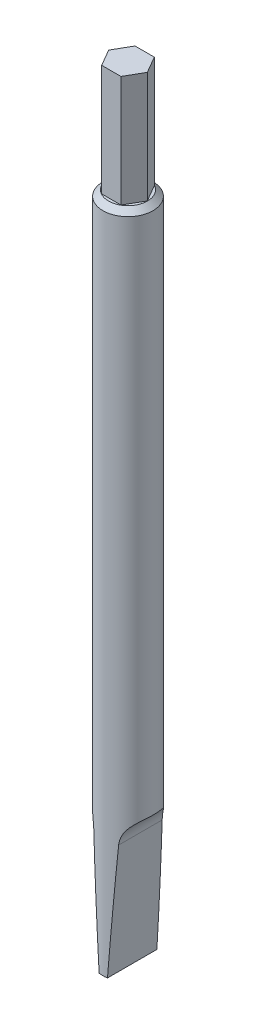
ISO-10303-21;
HEADER;
FILE_DESCRIPTION(('STEP AP214'),'2;1');
FILE_NAME('part.step','',(''),(''),'','','');
FILE_SCHEMA(('AUTOMOTIVE_DESIGN { 1 0 10303 214 1 1 1 1 }'));
ENDSEC;
DATA;
#1=APPLICATION_CONTEXT('core data for automotive mechanical design processes');
#2=APPLICATION_PROTOCOL_DEFINITION('international standard','automotive_design',2000,#1);
#3=PRODUCT_CONTEXT('',#1,'mechanical');
#4=PRODUCT('Part','Part','',(#3));
#5=PRODUCT_RELATED_PRODUCT_CATEGORY('part','',(#4));
#6=PRODUCT_DEFINITION_FORMATION('','',#4);
#7=PRODUCT_DEFINITION_CONTEXT('part definition',#1,'design');
#8=PRODUCT_DEFINITION('design','',#6,#7);
#9=PRODUCT_DEFINITION_SHAPE('','',#8);
#10=(LENGTH_UNIT() NAMED_UNIT(*) SI_UNIT(.MILLI.,.METRE.));
#11=(NAMED_UNIT(*) PLANE_ANGLE_UNIT() SI_UNIT($,.RADIAN.));
#12=(NAMED_UNIT(*) SI_UNIT($,.STERADIAN.) SOLID_ANGLE_UNIT());
#13=UNCERTAINTY_MEASURE_WITH_UNIT(LENGTH_MEASURE(1.E-05),#10,'distance_accuracy_value','');
#14=(GEOMETRIC_REPRESENTATION_CONTEXT(3) GLOBAL_UNCERTAINTY_ASSIGNED_CONTEXT((#13)) GLOBAL_UNIT_ASSIGNED_CONTEXT((#10,
#11,#12)) REPRESENTATION_CONTEXT('',''));
#15=CARTESIAN_POINT('',(0.,0.,0.));
#16=DIRECTION('',(0.,0.,1.));
#17=DIRECTION('',(1.,0.,0.));
#18=AXIS2_PLACEMENT_3D('',#15,#16,#17);
#19=CARTESIAN_POINT('',(0.,-120.,0.));
#20=DIRECTION('',(0.,1.,0.));
#21=DIRECTION('',(0.,0.,1.));
#22=AXIS2_PLACEMENT_3D('',#19,#20,#21);
#23=PLANE('',#22);
#24=DIRECTION('',(0.,0.,1.));
#25=VECTOR('',#24,1.);
#26=CARTESIAN_POINT('',(-0.750000000000048,-120.,-7.));
#27=LINE('',#26,#25);
#28=CARTESIAN_POINT('',(-0.750000000000048,-120.,-4.4370598373247));
#29=VERTEX_POINT('',#28);
#30=CARTESIAN_POINT('',(-0.750000000000046,-120.,4.4370598373247));
#31=VERTEX_POINT('',#30);
#32=EDGE_CURVE('E58',#29,#31,#27,.T.);
#33=ORIENTED_EDGE('',*,*,#32,.F.);
#34=CARTESIAN_POINT('',(0.,-120.,0.));
#35=DIRECTION('',(0.,1.,0.));
#36=DIRECTION('',(0.,0.,1.));
#37=AXIS2_PLACEMENT_3D('',#34,#35,#36);
#38=CIRCLE('',#37,4.5);
#39=CARTESIAN_POINT('',(0.750000000000048,-120.,-4.4370598373247));
#40=VERTEX_POINT('',#39);
#41=EDGE_CURVE('E143',#40,#29,#38,.T.);
#42=ORIENTED_EDGE('',*,*,#41,.F.);
#43=DIRECTION('',(0.,0.,1.));
#44=VECTOR('',#43,1.);
#45=CARTESIAN_POINT('',(0.750000000000048,-120.,-7.));
#46=LINE('',#45,#44);
#47=CARTESIAN_POINT('',(0.750000000000048,-120.,4.4370598373247));
#48=VERTEX_POINT('',#47);
#49=EDGE_CURVE('E164',#40,#48,#46,.T.);
#50=ORIENTED_EDGE('',*,*,#49,.T.);
#51=EDGE_CURVE('E242',#31,#48,#38,.T.);
#52=ORIENTED_EDGE('',*,*,#51,.F.);
#53=EDGE_LOOP('',(#33,#42,#50,#52));
#54=FACE_BOUND('',#53,.T.);
#55=ADVANCED_FACE('F44',(#54),#23,.F.);
#56=CARTESIAN_POINT('',(0.,-120.,0.));
#57=DIRECTION('',(0.,1.,0.));
#58=DIRECTION('',(0.,0.,1.));
#59=AXIS2_PLACEMENT_3D('',#56,#57,#58);
#60=CYLINDRICAL_SURFACE('',#59,4.5);
#61=CARTESIAN_POINT('',(0.,-130.725499692536,0.));
#62=DIRECTION('',(0.997564050259825,0.069756473744118,0.));
#63=DIRECTION('',(-0.0697564737441181,0.997564050259825,0.));
#64=AXIS2_PLACEMENT_3D('',#61,#62,#63);
#65=ELLIPSE('',#64,64.5101416179233,4.5);
#66=CARTESIAN_POINT('',(-2.22904475760726,-98.8486745427176,-3.90913794443015));
#67=VERTEX_POINT('',#66);
#68=EDGE_CURVE('E246',#67,#29,#65,.F.);
#69=ORIENTED_EDGE('',*,*,#68,.F.);
#70=CARTESIAN_POINT('',(-2.22904475760726,-98.8486745427176,-3.90913794443015));
#71=CARTESIAN_POINT('',(-2.23702621646599,-98.7342787867655,-3.90455301412375));
#72=CARTESIAN_POINT('',(-2.24897237830153,-98.6202409171084,-3.8977412424686));
#73=CARTESIAN_POINT('',(-2.28058564520308,-98.3935946749975,-3.87934716952949));
#74=CARTESIAN_POINT('',(-2.30025513874378,-98.2809867558942,-3.8677633924271));
#75=CARTESIAN_POINT('',(-2.34719584400121,-98.0575363098174,-3.83945395370803));
#76=CARTESIAN_POINT('',(-2.37449738593542,-97.9467027315232,-3.82270774842759));
#77=CARTESIAN_POINT('',(-2.43629843668387,-97.7280755292208,-3.78362142886627));
#78=CARTESIAN_POINT('',(-2.47079727307916,-97.6202816222935,-3.76128183711765));
#79=CARTESIAN_POINT('',(-2.54660406210738,-97.408216560908,-3.71037687082045));
#80=CARTESIAN_POINT('',(-2.58793317273797,-97.3039576056025,-3.68179205909023));
#81=CARTESIAN_POINT('',(-2.67661907337453,-97.1001945116028,-3.617830510263));
#82=CARTESIAN_POINT('',(-2.72397536155982,-97.0006899780047,-3.58245433848772));
#83=CARTESIAN_POINT('',(-2.82369022401107,-96.8075192575304,-3.50439309765493));
#84=CARTESIAN_POINT('',(-2.87603716753387,-96.7138402977947,-3.46172484722618));
#85=CARTESIAN_POINT('',(-2.98468304106419,-96.5329182426583,-3.36849906138697));
#86=CARTESIAN_POINT('',(-3.04098155002159,-96.4456744635971,-3.31794236581196));
#87=CARTESIAN_POINT('',(-3.15218326142471,-96.2841591543177,-3.2123516689927));
#88=CARTESIAN_POINT('',(-3.20691354791837,-96.2094077407048,-3.15786937601245));
#89=CARTESIAN_POINT('',(-3.31737747759314,-96.0666193508309,-3.04161662066179));
#90=CARTESIAN_POINT('',(-3.37311101683253,-95.9985816836745,-2.97984690966121));
#91=CARTESIAN_POINT('',(-3.48426592602746,-95.86955084334,-2.84907936053115));
#92=CARTESIAN_POINT('',(-3.53968727940554,-95.8085580409603,-2.78008114230153));
#93=CARTESIAN_POINT('',(-3.64887642748699,-95.6937825954874,-2.63513370421151));
#94=CARTESIAN_POINT('',(-3.70264431849594,-95.6399995318489,-2.55918489021554));
#95=CARTESIAN_POINT('',(-3.80240311983266,-95.5442692448825,-2.40814230508492));
#96=CARTESIAN_POINT('',(-3.84865318926918,-95.5016872490807,-2.33362025159598));
#97=CARTESIAN_POINT('',(-3.9378876480611,-95.4222911569373,-2.1796692127272));
#98=CARTESIAN_POINT('',(-3.98087099331307,-95.3854789007472,-2.10023867309246));
#99=CARTESIAN_POINT('',(-4.06277994182611,-95.3174332764953,-1.93704749879933));
#100=CARTESIAN_POINT('',(-4.10170651974428,-95.2861985671095,-1.85328791148249));
#101=CARTESIAN_POINT('',(-4.17488472425587,-95.2290171572651,-1.68196842738304));
#102=CARTESIAN_POINT('',(-4.20913455413963,-95.2030724872524,-1.59440708697686));
#103=CARTESIAN_POINT('',(-4.27279286567593,-95.1559191061295,-1.41506271783801));
#104=CARTESIAN_POINT('',(-4.30213927068598,-95.1347700620595,-1.32324199674037));
#105=CARTESIAN_POINT('',(-4.35507754079022,-95.0973075393074,-1.13696065361358));
#106=CARTESIAN_POINT('',(-4.37866744162886,-95.0809957107901,-1.04249914270462));
#107=CARTESIAN_POINT('',(-4.4197653908091,-95.0529601985635,-0.851591587608831));
#108=CARTESIAN_POINT('',(-4.43727323385286,-95.0412366697289,-0.755145476548861));
#109=CARTESIAN_POINT('',(-4.4659873816768,-95.0221761964409,-0.560890393805502));
#110=CARTESIAN_POINT('',(-4.47719343889634,-95.014839424317,-0.463081368735776));
#111=CARTESIAN_POINT('',(-4.49360841061999,-95.0041316886795,-0.261310371063201));
#112=CARTESIAN_POINT('',(-4.49845362158802,-95.001001013529,-0.157305834671538));
#113=CARTESIAN_POINT('',(-4.50091605877074,-94.9994070035386,0.0507912499549168));
#114=CARTESIAN_POINT('',(-4.49853547669683,-95.0009422534409,0.154883761930143));
#115=CARTESIAN_POINT('',(-4.48657840402764,-95.0087117525025,0.362541163810425));
#116=CARTESIAN_POINT('',(-4.47699769520909,-95.0149487562099,0.466105708581837));
#117=CARTESIAN_POINT('',(-4.45076624447433,-95.0322505562378,0.671888596740895));
#118=CARTESIAN_POINT('',(-4.43411819762721,-95.0433135122668,0.77410743799697));
#119=CARTESIAN_POINT('',(-4.39361106688486,-95.0707334624376,0.978376392649263));
#120=CARTESIAN_POINT('',(-4.36962505271904,-95.0871840351622,1.08038886357039));
#121=CARTESIAN_POINT('',(-4.31493201627953,-95.1256145106216,1.28148931228222));
#122=CARTESIAN_POINT('',(-4.28422761082079,-95.1475922610158,1.38057841172089));
#123=CARTESIAN_POINT('',(-4.21660333411226,-95.1974328302393,1.57507265805737));
#124=CARTESIAN_POINT('',(-4.17968451408553,-95.2252946539282,1.67047842467343));
#125=CARTESIAN_POINT('',(-4.10029171346883,-95.287277239646,1.85684260853614));
#126=CARTESIAN_POINT('',(-4.05781801371186,-95.3213976852984,1.94780125029288));
#127=CARTESIAN_POINT('',(-3.9698058752651,-95.3948568070534,2.12126105031409));
#128=CARTESIAN_POINT('',(-3.92443872232141,-95.4339560171982,2.20395054168729));
#129=CARTESIAN_POINT('',(-3.83019636416512,-95.5185327371687,2.36394116852965));
#130=CARTESIAN_POINT('',(-3.78131996922832,-95.5640124151713,2.44124045890575));
#131=CARTESIAN_POINT('',(-3.68113041341153,-95.6614341851423,2.58984633123176));
#132=CARTESIAN_POINT('',(-3.62981927482608,-95.7133709699942,2.66115775490603));
#133=CARTESIAN_POINT('',(-3.52580828649945,-95.8237571580948,2.79750455439798));
#134=CARTESIAN_POINT('',(-3.47310795095011,-95.8822088633403,2.86253769658987));
#135=CARTESIAN_POINT('',(-3.3701354264968,-96.0023647883848,2.98297651089297));
#136=CARTESIAN_POINT('',(-3.31987400410266,-96.0637589014692,3.03870143596111));
#137=CARTESIAN_POINT('',(-3.22010235349993,-96.1920464231747,3.14423550741772));
#138=CARTESIAN_POINT('',(-3.17059239777905,-96.2589417727001,3.19404255062079));
#139=CARTESIAN_POINT('',(-3.07327174497449,-96.3978454439555,3.28779056711402));
#140=CARTESIAN_POINT('',(-3.02546067731881,-96.4698526402566,3.33173282550278));
#141=CARTESIAN_POINT('',(-2.93234054623072,-96.6185905027541,3.41397726201647));
#142=CARTESIAN_POINT('',(-2.8870324023724,-96.6953228833739,3.45227737571844));
#143=CARTESIAN_POINT('',(-2.79834911591692,-96.8553772948419,3.52457291290431));
#144=CARTESIAN_POINT('',(-2.75507290609885,-96.9388280265469,3.55840449081349));
#145=CARTESIAN_POINT('',(-2.67261260417682,-97.1096893198159,3.6207479664608));
#146=CARTESIAN_POINT('',(-2.63343032729209,-97.1971016134855,3.64925750881826));
#147=CARTESIAN_POINT('',(-2.55970296754417,-97.3753297429374,3.70134563535075));
#148=CARTESIAN_POINT('',(-2.5251599933945,-97.4661471026036,3.72492197992577));
#149=CARTESIAN_POINT('',(-2.4611572142634,-97.6505978419933,3.76751692246681));
#150=CARTESIAN_POINT('',(-2.43169749165579,-97.7442312673221,3.78653544657554));
#151=CARTESIAN_POINT('',(-2.38186601038419,-97.9207414664064,3.81804381376269));
#152=CARTESIAN_POINT('',(-2.36080172872791,-98.0033285244547,3.83107165117271));
#153=CARTESIAN_POINT('',(-2.32285508466947,-98.1698579279807,3.85419730016862));
#154=CARTESIAN_POINT('',(-2.30597247690749,-98.2538001936336,3.86429528366972));
#155=CARTESIAN_POINT('',(-2.27654460459316,-98.4225084552289,3.8817060828584));
#156=CARTESIAN_POINT('',(-2.26398868533896,-98.5072718914802,3.8890257448936));
#157=CARTESIAN_POINT('',(-2.24323185058359,-98.6775140433749,3.90102964912079));
#158=CARTESIAN_POINT('',(-2.23503083893241,-98.762992743184,3.90571394949785));
#159=CARTESIAN_POINT('',(-2.22904475760726,-98.8486745427176,3.90913794443015));
#160=B_SPLINE_CURVE_WITH_KNOTS('',3,(#70,#71,#72,#73,#74,#75,#76,#77,#78,#79,#80,#81,#82,#83,
#84,#85,#86,#87,#88,#89,#90,#91,#92,#93,#94,#95,#96,#97,#98,#99,#100,#101,#102,#103,#104,#105,
#106,#107,#108,#109,#110,#111,#112,#113,#114,#115,#116,#117,#118,#119,#120,#121,#122,#123,#124,
#125,#126,#127,#128,#129,#130,#131,#132,#133,#134,#135,#136,#137,#138,#139,#140,#141,#142,#143,
#144,#145,#146,#147,#148,#149,#150,#151,#152,#153,#154,#155,#156,#157,#158,#159),.UNSPECIFIED.,
.F.,.F.,(4,2,2,2,2,2,2,2,2,2,2,2,2,2,2,2,2,2,2,2,2,2,2,2,2,2,2,2,2,2,2,2,2,2,2,2,2,2,2,2,2,2,2,
2,4),(0.,0.344218673375685,0.688543881854537,1.034257402969,1.37993863968714,1.72671147818453,
2.0734554633616,2.41941024420032,2.76532821840735,3.08731527466603,3.40926916138802,
3.73123998607428,4.05319202197884,4.34533978740265,4.63758053917157,4.9297509160952,
5.22203322490105,5.51777376437488,5.81361507685581,6.10946637439188,6.40532929339924,
6.71746313275987,7.02950230584368,7.34172443098354,7.65382759968245,7.97166795893536,
8.28938473897333,8.60704782832546,8.92469486407736,9.23060206706414,9.53661347476214,
9.84237501312754,10.1482449345383,10.4387759573693,10.7294099265601,11.0199801067687,
11.3106563419919,11.6100631974405,11.9096022492632,12.2092769938198,12.5089565941337,
12.7674602840365,13.0259488026338,13.2837961526944,13.5416378096241),.UNSPECIFIED.);
#161=CARTESIAN_POINT('',(-2.22904475760726,-98.8486745427176,3.90913794443015));
#162=VERTEX_POINT('',#161);
#163=EDGE_CURVE('E12',#67,#162,#160,.T.);
#164=ORIENTED_EDGE('',*,*,#163,.T.);
#165=EDGE_CURVE('E252',#31,#162,#65,.F.);
#166=ORIENTED_EDGE('',*,*,#165,.F.);
#167=ORIENTED_EDGE('',*,*,#51,.T.);
#168=CARTESIAN_POINT('',(0.,-130.725499692536,0.));
#169=DIRECTION('',(0.997564050259825,-0.069756473744118,0.));
#170=DIRECTION('',(0.0697564737441181,0.997564050259825,0.));
#171=AXIS2_PLACEMENT_3D('',#168,#169,#170);
#172=ELLIPSE('',#171,64.5101416179233,4.5);
#173=CARTESIAN_POINT('',(2.22904475760726,-98.8486745427176,3.90913794443015));
#174=VERTEX_POINT('',#173);
#175=EDGE_CURVE('E245',#48,#174,#172,.F.);
#176=ORIENTED_EDGE('',*,*,#175,.T.);
#177=CARTESIAN_POINT('',(2.22904475760726,-98.8486745427176,-3.90913794443015));
#178=CARTESIAN_POINT('',(2.23702621646599,-98.7342787867655,-3.90455301412375));
#179=CARTESIAN_POINT('',(2.24897237830153,-98.6202409171084,-3.8977412424686));
#180=CARTESIAN_POINT('',(2.28058564520308,-98.3935946749975,-3.87934716952949));
#181=CARTESIAN_POINT('',(2.30025513874378,-98.2809867558942,-3.8677633924271));
#182=CARTESIAN_POINT('',(2.34719584400121,-98.0575363098174,-3.83945395370803));
#183=CARTESIAN_POINT('',(2.37449738593542,-97.9467027315232,-3.82270774842759));
#184=CARTESIAN_POINT('',(2.43629843668387,-97.7280755292208,-3.78362142886627));
#185=CARTESIAN_POINT('',(2.47079727307916,-97.6202816222935,-3.76128183711765));
#186=CARTESIAN_POINT('',(2.54660406210738,-97.408216560908,-3.71037687082045));
#187=CARTESIAN_POINT('',(2.58793317273797,-97.3039576056025,-3.68179205909023));
#188=CARTESIAN_POINT('',(2.67661907337453,-97.1001945116028,-3.617830510263));
#189=CARTESIAN_POINT('',(2.72397536155982,-97.0006899780047,-3.58245433848772));
#190=CARTESIAN_POINT('',(2.82369022401107,-96.8075192575304,-3.50439309765493));
#191=CARTESIAN_POINT('',(2.87603716753387,-96.7138402977947,-3.46172484722618));
#192=CARTESIAN_POINT('',(2.98468304106419,-96.5329182426583,-3.36849906138697));
#193=CARTESIAN_POINT('',(3.04098155002159,-96.4456744635971,-3.31794236581196));
#194=CARTESIAN_POINT('',(3.15218326142471,-96.2841591543177,-3.2123516689927));
#195=CARTESIAN_POINT('',(3.20691354791837,-96.2094077407048,-3.15786937601245));
#196=CARTESIAN_POINT('',(3.31737747759314,-96.0666193508309,-3.04161662066179));
#197=CARTESIAN_POINT('',(3.37311101683253,-95.9985816836745,-2.97984690966121));
#198=CARTESIAN_POINT('',(3.48426592602746,-95.86955084334,-2.84907936053115));
#199=CARTESIAN_POINT('',(3.53968727940554,-95.8085580409603,-2.78008114230153));
#200=CARTESIAN_POINT('',(3.64887642748699,-95.6937825954874,-2.63513370421151));
#201=CARTESIAN_POINT('',(3.70264431849594,-95.6399995318489,-2.55918489021554));
#202=CARTESIAN_POINT('',(3.80240311983266,-95.5442692448825,-2.40814230508492));
#203=CARTESIAN_POINT('',(3.84865318926918,-95.5016872490807,-2.33362025159598));
#204=CARTESIAN_POINT('',(3.9378876480611,-95.4222911569373,-2.1796692127272));
#205=CARTESIAN_POINT('',(3.98087099331307,-95.3854789007472,-2.10023867309246));
#206=CARTESIAN_POINT('',(4.06277994182611,-95.3174332764953,-1.93704749879933));
#207=CARTESIAN_POINT('',(4.10170651974428,-95.2861985671095,-1.85328791148249));
#208=CARTESIAN_POINT('',(4.17488472425587,-95.2290171572651,-1.68196842738304));
#209=CARTESIAN_POINT('',(4.20913455413963,-95.2030724872524,-1.59440708697686));
#210=CARTESIAN_POINT('',(4.27279286567593,-95.1559191061295,-1.41506271783801));
#211=CARTESIAN_POINT('',(4.30213927068598,-95.1347700620595,-1.32324199674037));
#212=CARTESIAN_POINT('',(4.35507754079022,-95.0973075393074,-1.13696065361358));
#213=CARTESIAN_POINT('',(4.37866744162886,-95.0809957107901,-1.04249914270462));
#214=CARTESIAN_POINT('',(4.4197653908091,-95.0529601985635,-0.851591587608831));
#215=CARTESIAN_POINT('',(4.43727323385286,-95.0412366697289,-0.755145476548861));
#216=CARTESIAN_POINT('',(4.4659873816768,-95.0221761964409,-0.560890393805502));
#217=CARTESIAN_POINT('',(4.47719343889634,-95.014839424317,-0.463081368735776));
#218=CARTESIAN_POINT('',(4.49360841061999,-95.0041316886795,-0.261310371063201));
#219=CARTESIAN_POINT('',(4.49845362158802,-95.001001013529,-0.157305834671538));
#220=CARTESIAN_POINT('',(4.50091605877074,-94.9994070035386,0.0507912499549168));
#221=CARTESIAN_POINT('',(4.49853547669683,-95.0009422534409,0.154883761930143));
#222=CARTESIAN_POINT('',(4.48657840402764,-95.0087117525025,0.362541163810425));
#223=CARTESIAN_POINT('',(4.47699769520909,-95.0149487562099,0.466105708581837));
#224=CARTESIAN_POINT('',(4.45076624447433,-95.0322505562378,0.671888596740895));
#225=CARTESIAN_POINT('',(4.43411819762721,-95.0433135122668,0.77410743799697));
#226=CARTESIAN_POINT('',(4.39361106688486,-95.0707334624376,0.978376392649263));
#227=CARTESIAN_POINT('',(4.36962505271904,-95.0871840351622,1.08038886357039));
#228=CARTESIAN_POINT('',(4.31493201627953,-95.1256145106216,1.28148931228222));
#229=CARTESIAN_POINT('',(4.28422761082079,-95.1475922610158,1.38057841172089));
#230=CARTESIAN_POINT('',(4.21660333411226,-95.1974328302393,1.57507265805737));
#231=CARTESIAN_POINT('',(4.17968451408553,-95.2252946539282,1.67047842467343));
#232=CARTESIAN_POINT('',(4.10029171346883,-95.287277239646,1.85684260853614));
#233=CARTESIAN_POINT('',(4.05781801371186,-95.3213976852984,1.94780125029288));
#234=CARTESIAN_POINT('',(3.9698058752651,-95.3948568070534,2.12126105031409));
#235=CARTESIAN_POINT('',(3.92443872232141,-95.4339560171982,2.20395054168729));
#236=CARTESIAN_POINT('',(3.83019636416512,-95.5185327371687,2.36394116852965));
#237=CARTESIAN_POINT('',(3.78131996922832,-95.5640124151713,2.44124045890575));
#238=CARTESIAN_POINT('',(3.68113041341153,-95.6614341851423,2.58984633123176));
#239=CARTESIAN_POINT('',(3.62981927482608,-95.7133709699942,2.66115775490603));
#240=CARTESIAN_POINT('',(3.52580828649945,-95.8237571580948,2.79750455439798));
#241=CARTESIAN_POINT('',(3.47310795095011,-95.8822088633403,2.86253769658987));
#242=CARTESIAN_POINT('',(3.3701354264968,-96.0023647883848,2.98297651089297));
#243=CARTESIAN_POINT('',(3.31987400410266,-96.0637589014692,3.03870143596111));
#244=CARTESIAN_POINT('',(3.22010235349993,-96.1920464231747,3.14423550741772));
#245=CARTESIAN_POINT('',(3.17059239777905,-96.2589417727001,3.19404255062079));
#246=CARTESIAN_POINT('',(3.07327174497449,-96.3978454439555,3.28779056711402));
#247=CARTESIAN_POINT('',(3.02546067731881,-96.4698526402566,3.33173282550278));
#248=CARTESIAN_POINT('',(2.93234054623072,-96.6185905027541,3.41397726201647));
#249=CARTESIAN_POINT('',(2.8870324023724,-96.6953228833739,3.45227737571844));
#250=CARTESIAN_POINT('',(2.79834911591692,-96.8553772948419,3.52457291290431));
#251=CARTESIAN_POINT('',(2.75507290609885,-96.9388280265469,3.55840449081349));
#252=CARTESIAN_POINT('',(2.67261260417682,-97.1096893198159,3.6207479664608));
#253=CARTESIAN_POINT('',(2.63343032729209,-97.1971016134855,3.64925750881826));
#254=CARTESIAN_POINT('',(2.55970296754417,-97.3753297429374,3.70134563535075));
#255=CARTESIAN_POINT('',(2.5251599933945,-97.4661471026036,3.72492197992577));
#256=CARTESIAN_POINT('',(2.4611572142634,-97.6505978419933,3.76751692246681));
#257=CARTESIAN_POINT('',(2.43169749165579,-97.7442312673221,3.78653544657554));
#258=CARTESIAN_POINT('',(2.38186601038419,-97.9207414664064,3.81804381376269));
#259=CARTESIAN_POINT('',(2.36080172872791,-98.0033285244547,3.83107165117271));
#260=CARTESIAN_POINT('',(2.32285508466947,-98.1698579279807,3.85419730016862));
#261=CARTESIAN_POINT('',(2.30597247690749,-98.2538001936336,3.86429528366972));
#262=CARTESIAN_POINT('',(2.27654460459316,-98.4225084552289,3.8817060828584));
#263=CARTESIAN_POINT('',(2.26398868533896,-98.5072718914802,3.8890257448936));
#264=CARTESIAN_POINT('',(2.24323185058359,-98.6775140433749,3.90102964912079));
#265=CARTESIAN_POINT('',(2.23503083893241,-98.762992743184,3.90571394949785));
#266=CARTESIAN_POINT('',(2.22904475760726,-98.8486745427176,3.90913794443015));
#267=B_SPLINE_CURVE_WITH_KNOTS('',3,(#177,#178,#179,#180,#181,#182,#183,#184,#185,#186,#187,
#188,#189,#190,#191,#192,#193,#194,#195,#196,#197,#198,#199,#200,#201,#202,#203,#204,#205,#206,
#207,#208,#209,#210,#211,#212,#213,#214,#215,#216,#217,#218,#219,#220,#221,#222,#223,#224,#225,
#226,#227,#228,#229,#230,#231,#232,#233,#234,#235,#236,#237,#238,#239,#240,#241,#242,#243,#244,
#245,#246,#247,#248,#249,#250,#251,#252,#253,#254,#255,#256,#257,#258,#259,#260,#261,#262,#263,
#264,#265,#266),.UNSPECIFIED.,.F.,.F.,(4,2,2,2,2,2,2,2,2,2,2,2,2,2,2,2,2,2,2,2,2,2,2,2,2,2,2,2,
2,2,2,2,2,2,2,2,2,2,2,2,2,2,2,2,4),(0.,0.344218673375685,0.688543881854537,1.034257402969,
1.37993863968714,1.72671147818453,2.0734554633616,2.41941024420032,2.76532821840735,
3.08731527466603,3.40926916138802,3.73123998607428,4.05319202197884,4.34533978740265,
4.63758053917157,4.9297509160952,5.22203322490105,5.51777376437488,5.81361507685581,
6.10946637439188,6.40532929339924,6.71746313275987,7.02950230584368,7.34172443098354,
7.65382759968245,7.97166795893536,8.28938473897333,8.60704782832546,8.92469486407736,
9.23060206706414,9.53661347476214,9.84237501312754,10.1482449345383,10.4387759573693,
10.7294099265601,11.0199801067687,11.3106563419919,11.6100631974405,11.9096022492632,
12.2092769938198,12.5089565941337,12.7674602840365,13.0259488026338,13.2837961526944,
13.5416378096241),.UNSPECIFIED.);
#268=CARTESIAN_POINT('',(2.22904475760726,-98.8486745427176,-3.90913794443015));
#269=VERTEX_POINT('',#268);
#270=EDGE_CURVE('E167',#269,#174,#267,.T.);
#271=ORIENTED_EDGE('',*,*,#270,.F.);
#272=EDGE_CURVE('E243',#269,#40,#172,.F.);
#273=ORIENTED_EDGE('',*,*,#272,.T.);
#274=ORIENTED_EDGE('',*,*,#41,.T.);
#275=EDGE_LOOP('',(#69,#164,#166,#167,#176,#271,#273,#274));
#276=FACE_BOUND('',#275,.T.);
#277=CARTESIAN_POINT('',(0.,-1.,0.));
#278=DIRECTION('',(0.,1.,0.));
#279=DIRECTION('',(0.,0.,1.));
#280=AXIS2_PLACEMENT_3D('',#277,#278,#279);
#281=CIRCLE('',#280,4.5);
#282=CARTESIAN_POINT('',(0.,-1.,4.5));
#283=VERTEX_POINT('',#282);
#284=EDGE_CURVE('E162',#283,#283,#281,.F.);
#285=ORIENTED_EDGE('',*,*,#284,.T.);
#286=EDGE_LOOP('',(#285));
#287=FACE_BOUND('',#286,.T.);
#288=ADVANCED_FACE('F174',(#276,#287),#60,.T.);
#289=CARTESIAN_POINT('',(1.73205080756891,20.,2.99999999999998));
#290=DIRECTION('',(-0.866025403784441,0.,-0.499999999999995));
#291=DIRECTION('',(-0.499999999999995,0.,0.866025403784442));
#292=AXIS2_PLACEMENT_3D('',#289,#290,#291);
#293=PLANE('',#292);
#294=DIRECTION('',(0.499999999999995,0.,-0.866025403784441));
#295=VECTOR('',#294,1.);
#296=CARTESIAN_POINT('',(1.73205080756891,0.,2.99999999999998));
#297=LINE('',#296,#295);
#298=CARTESIAN_POINT('',(1.73205080756891,0.,2.99999999999998));
#299=VERTEX_POINT('',#298);
#300=CARTESIAN_POINT('',(3.46410161513776,0.,0.));
#301=VERTEX_POINT('',#300);
#302=EDGE_CURVE('E98',#299,#301,#297,.T.);
#303=ORIENTED_EDGE('',*,*,#302,.T.);
#304=DIRECTION('',(0.,-1.,0.));
#305=VECTOR('',#304,1.);
#306=CARTESIAN_POINT('',(3.46410161513776,20.,0.));
#307=LINE('',#306,#305);
#308=CARTESIAN_POINT('',(3.46410161513776,20.,0.));
#309=VERTEX_POINT('',#308);
#310=EDGE_CURVE('E160',#309,#301,#307,.T.);
#311=ORIENTED_EDGE('',*,*,#310,.F.);
#312=DIRECTION('',(0.499999999999995,0.,-0.866025403784441));
#313=VECTOR('',#312,1.);
#314=CARTESIAN_POINT('',(1.73205080756891,20.,2.99999999999998));
#315=LINE('',#314,#313);
#316=CARTESIAN_POINT('',(1.73205080756891,20.,2.99999999999998));
#317=VERTEX_POINT('',#316);
#318=EDGE_CURVE('E149',#317,#309,#315,.T.);
#319=ORIENTED_EDGE('',*,*,#318,.F.);
#320=DIRECTION('',(0.,-1.,0.));
#321=VECTOR('',#320,1.);
#322=CARTESIAN_POINT('',(1.73205080756891,20.,2.99999999999998));
#323=LINE('',#322,#321);
#324=EDGE_CURVE('E133',#317,#299,#323,.T.);
#325=ORIENTED_EDGE('',*,*,#324,.T.);
#326=EDGE_LOOP('',(#303,#311,#319,#325));
#327=FACE_BOUND('',#326,.T.);
#328=ADVANCED_FACE('F216',(#327),#293,.F.);
#329=CARTESIAN_POINT('',(3.46410161513776,20.,0.));
#330=DIRECTION('',(-0.866025403784438,0.,0.500000000000001));
#331=DIRECTION('',(0.500000000000001,0.,0.866025403784438));
#332=AXIS2_PLACEMENT_3D('',#329,#330,#331);
#333=PLANE('',#332);
#334=DIRECTION('',(-0.500000000000001,0.,-0.866025403784438));
#335=VECTOR('',#334,1.);
#336=CARTESIAN_POINT('',(3.46410161513776,0.,0.));
#337=LINE('',#336,#335);
#338=CARTESIAN_POINT('',(1.73205080756887,0.,-3.00000000000001));
#339=VERTEX_POINT('',#338);
#340=EDGE_CURVE('E138',#301,#339,#337,.T.);
#341=ORIENTED_EDGE('',*,*,#340,.T.);
#342=DIRECTION('',(0.,-1.,0.));
#343=VECTOR('',#342,1.);
#344=CARTESIAN_POINT('',(1.73205080756887,20.,-3.00000000000001));
#345=LINE('',#344,#343);
#346=CARTESIAN_POINT('',(1.73205080756887,20.,-3.00000000000001));
#347=VERTEX_POINT('',#346);
#348=EDGE_CURVE('E152',#347,#339,#345,.T.);
#349=ORIENTED_EDGE('',*,*,#348,.F.);
#350=DIRECTION('',(-0.500000000000001,0.,-0.866025403784438));
#351=VECTOR('',#350,1.);
#352=CARTESIAN_POINT('',(3.46410161513776,20.,0.));
#353=LINE('',#352,#351);
#354=EDGE_CURVE('E233',#309,#347,#353,.T.);
#355=ORIENTED_EDGE('',*,*,#354,.F.);
#356=ORIENTED_EDGE('',*,*,#310,.T.);
#357=EDGE_LOOP('',(#341,#349,#355,#356));
#358=FACE_BOUND('',#357,.T.);
#359=ADVANCED_FACE('F213',(#358),#333,.F.);
#360=CARTESIAN_POINT('',(1.73205080756887,20.,-3.00000000000001));
#361=DIRECTION('',(0.,0.,1.));
#362=DIRECTION('',(1.,0.,0.));
#363=AXIS2_PLACEMENT_3D('',#360,#361,#362);
#364=PLANE('',#363);
#365=DIRECTION('',(-1.,0.,0.));
#366=VECTOR('',#365,1.);
#367=CARTESIAN_POINT('',(1.73205080756887,0.,-3.00000000000001));
#368=LINE('',#367,#366);
#369=CARTESIAN_POINT('',(-1.73205080756889,0.,-2.99999999999999));
#370=VERTEX_POINT('',#369);
#371=EDGE_CURVE('E86',#339,#370,#368,.T.);
#372=ORIENTED_EDGE('',*,*,#371,.T.);
#373=DIRECTION('',(0.,-1.,0.));
#374=VECTOR('',#373,1.);
#375=CARTESIAN_POINT('',(-1.73205080756889,20.,-2.99999999999999));
#376=LINE('',#375,#374);
#377=CARTESIAN_POINT('',(-1.73205080756889,20.,-2.99999999999999));
#378=VERTEX_POINT('',#377);
#379=EDGE_CURVE('E129',#378,#370,#376,.T.);
#380=ORIENTED_EDGE('',*,*,#379,.F.);
#381=DIRECTION('',(-1.,0.,0.));
#382=VECTOR('',#381,1.);
#383=CARTESIAN_POINT('',(1.73205080756887,20.,-3.00000000000001));
#384=LINE('',#383,#382);
#385=EDGE_CURVE('E120',#347,#378,#384,.T.);
#386=ORIENTED_EDGE('',*,*,#385,.F.);
#387=ORIENTED_EDGE('',*,*,#348,.T.);
#388=EDGE_LOOP('',(#372,#380,#386,#387));
#389=FACE_BOUND('',#388,.T.);
#390=ADVANCED_FACE('F209',(#389),#364,.F.);
#391=CARTESIAN_POINT('',(-1.73205080756889,20.,-2.99999999999999));
#392=DIRECTION('',(0.866025403784442,0.,0.499999999999995));
#393=DIRECTION('',(0.499999999999995,0.,-0.866025403784442));
#394=AXIS2_PLACEMENT_3D('',#391,#392,#393);
#395=PLANE('',#394);
#396=DIRECTION('',(-0.499999999999995,0.,0.866025403784441));
#397=VECTOR('',#396,1.);
#398=CARTESIAN_POINT('',(-1.73205080756889,0.,-2.99999999999999));
#399=LINE('',#398,#397);
#400=CARTESIAN_POINT('',(-3.46410161513776,0.,0.));
#401=VERTEX_POINT('',#400);
#402=EDGE_CURVE('E127',#370,#401,#399,.T.);
#403=ORIENTED_EDGE('',*,*,#402,.T.);
#404=DIRECTION('',(0.,-1.,0.));
#405=VECTOR('',#404,1.);
#406=CARTESIAN_POINT('',(-3.46410161513776,20.,0.));
#407=LINE('',#406,#405);
#408=CARTESIAN_POINT('',(-3.46410161513776,20.,0.));
#409=VERTEX_POINT('',#408);
#410=EDGE_CURVE('E121',#409,#401,#407,.T.);
#411=ORIENTED_EDGE('',*,*,#410,.F.);
#412=DIRECTION('',(-0.499999999999995,0.,0.866025403784441));
#413=VECTOR('',#412,1.);
#414=CARTESIAN_POINT('',(-1.73205080756889,20.,-2.99999999999999));
#415=LINE('',#414,#413);
#416=EDGE_CURVE('E109',#378,#409,#415,.T.);
#417=ORIENTED_EDGE('',*,*,#416,.F.);
#418=ORIENTED_EDGE('',*,*,#379,.T.);
#419=EDGE_LOOP('',(#403,#411,#417,#418));
#420=FACE_BOUND('',#419,.T.);
#421=ADVANCED_FACE('F123',(#420),#395,.F.);
#422=CARTESIAN_POINT('',(-3.46410161513776,20.,0.));
#423=DIRECTION('',(0.866025403784435,0.,-0.500000000000007));
#424=DIRECTION('',(-0.500000000000007,0.,-0.866025403784435));
#425=AXIS2_PLACEMENT_3D('',#422,#423,#424);
#426=PLANE('',#425);
#427=DIRECTION('',(0.500000000000007,0.,0.866025403784434));
#428=VECTOR('',#427,1.);
#429=CARTESIAN_POINT('',(-3.46410161513776,0.,0.));
#430=LINE('',#429,#428);
#431=CARTESIAN_POINT('',(-1.73205080756885,0.,3.00000000000002));
#432=VERTEX_POINT('',#431);
#433=EDGE_CURVE('E144',#401,#432,#430,.T.);
#434=ORIENTED_EDGE('',*,*,#433,.T.);
#435=DIRECTION('',(0.,-1.,0.));
#436=VECTOR('',#435,1.);
#437=CARTESIAN_POINT('',(-1.73205080756885,20.,3.00000000000002));
#438=LINE('',#437,#436);
#439=CARTESIAN_POINT('',(-1.73205080756885,20.,3.00000000000002));
#440=VERTEX_POINT('',#439);
#441=EDGE_CURVE('E128',#440,#432,#438,.T.);
#442=ORIENTED_EDGE('',*,*,#441,.F.);
#443=DIRECTION('',(0.500000000000007,0.,0.866025403784434));
#444=VECTOR('',#443,1.);
#445=CARTESIAN_POINT('',(-3.46410161513776,20.,0.));
#446=LINE('',#445,#444);
#447=EDGE_CURVE('E111',#409,#440,#446,.T.);
#448=ORIENTED_EDGE('',*,*,#447,.F.);
#449=ORIENTED_EDGE('',*,*,#410,.T.);
#450=EDGE_LOOP('',(#434,#442,#448,#449));
#451=FACE_BOUND('',#450,.T.);
#452=ADVANCED_FACE('F135',(#451),#426,.F.);
#453=CARTESIAN_POINT('',(-1.73205080756885,20.,3.00000000000002));
#454=DIRECTION('',(0.,0.,-1.));
#455=DIRECTION('',(-1.,0.,0.));
#456=AXIS2_PLACEMENT_3D('',#453,#454,#455);
#457=PLANE('',#456);
#458=DIRECTION('',(1.,0.,0.));
#459=VECTOR('',#458,1.);
#460=CARTESIAN_POINT('',(-1.73205080756885,0.,3.00000000000002));
#461=LINE('',#460,#459);
#462=EDGE_CURVE('E150',#432,#299,#461,.T.);
#463=ORIENTED_EDGE('',*,*,#462,.T.);
#464=ORIENTED_EDGE('',*,*,#324,.F.);
#465=DIRECTION('',(1.,0.,0.));
#466=VECTOR('',#465,1.);
#467=CARTESIAN_POINT('',(-1.73205080756885,20.,3.00000000000002));
#468=LINE('',#467,#466);
#469=EDGE_CURVE('E73',#440,#317,#468,.T.);
#470=ORIENTED_EDGE('',*,*,#469,.F.);
#471=ORIENTED_EDGE('',*,*,#441,.T.);
#472=EDGE_LOOP('',(#463,#464,#470,#471));
#473=FACE_BOUND('',#472,.T.);
#474=ADVANCED_FACE('F197',(#473),#457,.F.);
#475=CARTESIAN_POINT('',(0.,20.,0.));
#476=DIRECTION('',(0.,1.,0.));
#477=DIRECTION('',(0.,0.,1.));
#478=AXIS2_PLACEMENT_3D('',#475,#476,#477);
#479=PLANE('',#478);
#480=ORIENTED_EDGE('',*,*,#318,.T.);
#481=ORIENTED_EDGE('',*,*,#354,.T.);
#482=ORIENTED_EDGE('',*,*,#385,.T.);
#483=ORIENTED_EDGE('',*,*,#416,.T.);
#484=ORIENTED_EDGE('',*,*,#447,.T.);
#485=ORIENTED_EDGE('',*,*,#469,.T.);
#486=EDGE_LOOP('',(#480,#481,#482,#483,#484,#485));
#487=FACE_BOUND('',#486,.T.);
#488=ADVANCED_FACE('F115',(#487),#479,.T.);
#489=CARTESIAN_POINT('',(0.,0.,0.));
#490=DIRECTION('',(0.,1.,0.));
#491=DIRECTION('',(0.,0.,1.));
#492=AXIS2_PLACEMENT_3D('',#489,#490,#491);
#493=PLANE('',#492);
#494=CARTESIAN_POINT('',(0.,0.,0.));
#495=DIRECTION('',(0.,1.,0.));
#496=DIRECTION('',(0.,0.,1.));
#497=AXIS2_PLACEMENT_3D('',#494,#495,#496);
#498=CIRCLE('',#497,3.5);
#499=CARTESIAN_POINT('',(0.,0.,3.5));
#500=VERTEX_POINT('',#499);
#501=EDGE_CURVE('E159',#500,#500,#498,.T.);
#502=ORIENTED_EDGE('',*,*,#501,.T.);
#503=EDGE_LOOP('',(#502));
#504=FACE_BOUND('',#503,.T.);
#505=ORIENTED_EDGE('',*,*,#302,.F.);
#506=ORIENTED_EDGE('',*,*,#462,.F.);
#507=ORIENTED_EDGE('',*,*,#433,.F.);
#508=ORIENTED_EDGE('',*,*,#402,.F.);
#509=ORIENTED_EDGE('',*,*,#371,.F.);
#510=ORIENTED_EDGE('',*,*,#340,.F.);
#511=EDGE_LOOP('',(#505,#506,#507,#508,#509,#510));
#512=FACE_BOUND('',#511,.T.);
#513=ADVANCED_FACE('F189',(#504,#512),#493,.T.);
#514=CARTESIAN_POINT('',(0.,0.,0.));
#515=DIRECTION('',(0.,-1.,0.));
#516=DIRECTION('',(0.,0.,-1.));
#517=AXIS2_PLACEMENT_3D('',#514,#515,#516);
#518=CONICAL_SURFACE('',#517,3.5,0.785398163397446);
#519=ORIENTED_EDGE('',*,*,#284,.F.);
#520=EDGE_LOOP('',(#519));
#521=FACE_BOUND('',#520,.T.);
#522=ORIENTED_EDGE('',*,*,#501,.F.);
#523=EDGE_LOOP('',(#522));
#524=FACE_BOUND('',#523,.T.);
#525=ADVANCED_FACE('F48',(#521,#524),#518,.T.);
#526=CARTESIAN_POINT('',(9.0967365833812,-0.636105788365682,-7.));
#527=DIRECTION('',(0.997564050259825,-0.069756473744118,0.));
#528=DIRECTION('',(0.0697564737441181,0.997564050259825,0.));
#529=AXIS2_PLACEMENT_3D('',#526,#527,#528);
#530=PLANE('',#529);
#531=DIRECTION('',(0.,0.,1.));
#532=VECTOR('',#531,1.);
#533=CARTESIAN_POINT('',(2.22904475760726,-98.8486745427176,-7.));
#534=LINE('',#533,#532);
#535=EDGE_CURVE('E247',#269,#174,#534,.T.);
#536=ORIENTED_EDGE('',*,*,#535,.T.);
#537=ORIENTED_EDGE('',*,*,#175,.F.);
#538=ORIENTED_EDGE('',*,*,#49,.F.);
#539=ORIENTED_EDGE('',*,*,#272,.F.);
#540=EDGE_LOOP('',(#536,#537,#538,#539));
#541=FACE_BOUND('',#540,.T.);
#542=ADVANCED_FACE('F181',(#541),#530,.T.);
#543=CARTESIAN_POINT('',(7.21686500890638,-99.1974569114382,-7.));
#544=DIRECTION('',(0.,0.,1.));
#545=DIRECTION('',(1.,0.,0.));
#546=AXIS2_PLACEMENT_3D('',#543,#544,#545);
#547=CYLINDRICAL_SURFACE('',#546,5.);
#548=ORIENTED_EDGE('',*,*,#535,.F.);
#549=ORIENTED_EDGE('',*,*,#270,.T.);
#550=EDGE_LOOP('',(#548,#549));
#551=FACE_BOUND('',#550,.T.);
#552=ADVANCED_FACE('F179',(#551),#547,.F.);
#553=CARTESIAN_POINT('',(-7.21686500890638,-99.1974569114382,-7.));
#554=DIRECTION('',(0.,0.,1.));
#555=DIRECTION('',(1.,0.,0.));
#556=AXIS2_PLACEMENT_3D('',#553,#554,#555);
#557=CYLINDRICAL_SURFACE('',#556,5.);
#558=DIRECTION('',(0.,0.,1.));
#559=VECTOR('',#558,1.);
#560=CARTESIAN_POINT('',(-2.22904475760726,-98.8486745427176,-7.));
#561=LINE('',#560,#559);
#562=EDGE_CURVE('E255',#67,#162,#561,.T.);
#563=ORIENTED_EDGE('',*,*,#562,.T.);
#564=ORIENTED_EDGE('',*,*,#163,.F.);
#565=EDGE_LOOP('',(#563,#564));
#566=FACE_BOUND('',#565,.T.);
#567=ADVANCED_FACE('F185',(#566),#557,.F.);
#568=CARTESIAN_POINT('',(-9.0967365833812,-0.636105788365682,-7.));
#569=DIRECTION('',(0.997564050259825,0.069756473744118,0.));
#570=DIRECTION('',(-0.0697564737441181,0.997564050259825,0.));
#571=AXIS2_PLACEMENT_3D('',#568,#569,#570);
#572=PLANE('',#571);
#573=ORIENTED_EDGE('',*,*,#68,.T.);
#574=ORIENTED_EDGE('',*,*,#32,.T.);
#575=ORIENTED_EDGE('',*,*,#165,.T.);
#576=ORIENTED_EDGE('',*,*,#562,.F.);
#577=EDGE_LOOP('',(#573,#574,#575,#576));
#578=FACE_BOUND('',#577,.T.);
#579=ADVANCED_FACE('F271',(#578),#572,.F.);
#580=CLOSED_SHELL('',(#55,#288,#328,#359,#390,#421,#452,#474,#488,#513,#525,#542,#552,#567,#579));
#581=MANIFOLD_SOLID_BREP('B2',#580);
#582=ADVANCED_BREP_SHAPE_REPRESENTATION('',(#18,#581),#14);
#583=SHAPE_DEFINITION_REPRESENTATION(#9,#582);
ENDSEC;
END-ISO-10303-21;
